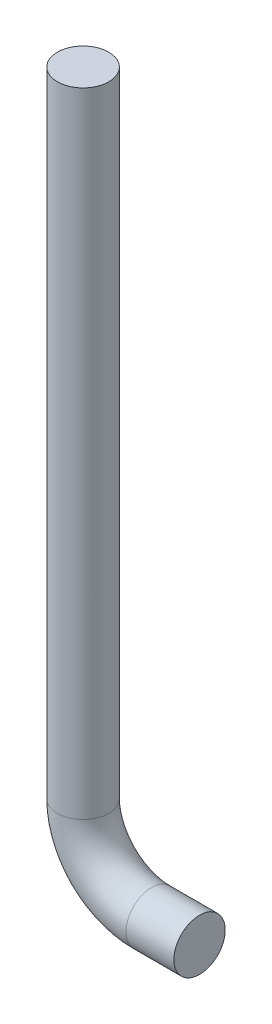
ISO-10303-21;
HEADER;
FILE_DESCRIPTION(('STEP AP214'),'2;1');
FILE_NAME('part.step','',(''),(''),'','','');
FILE_SCHEMA(('AUTOMOTIVE_DESIGN { 1 0 10303 214 1 1 1 1 }'));
ENDSEC;
DATA;
#1=APPLICATION_CONTEXT('core data for automotive mechanical design processes');
#2=APPLICATION_PROTOCOL_DEFINITION('international standard','automotive_design',2000,#1);
#3=PRODUCT_CONTEXT('',#1,'mechanical');
#4=PRODUCT('Part','Part','',(#3));
#5=PRODUCT_RELATED_PRODUCT_CATEGORY('part','',(#4));
#6=PRODUCT_DEFINITION_FORMATION('','',#4);
#7=PRODUCT_DEFINITION_CONTEXT('part definition',#1,'design');
#8=PRODUCT_DEFINITION('design','',#6,#7);
#9=PRODUCT_DEFINITION_SHAPE('','',#8);
#10=(LENGTH_UNIT() NAMED_UNIT(*) SI_UNIT(.MILLI.,.METRE.));
#11=(NAMED_UNIT(*) PLANE_ANGLE_UNIT() SI_UNIT($,.RADIAN.));
#12=(NAMED_UNIT(*) SI_UNIT($,.STERADIAN.) SOLID_ANGLE_UNIT());
#13=UNCERTAINTY_MEASURE_WITH_UNIT(LENGTH_MEASURE(1.E-05),#10,'distance_accuracy_value','');
#14=(GEOMETRIC_REPRESENTATION_CONTEXT(3) GLOBAL_UNCERTAINTY_ASSIGNED_CONTEXT((#13)) GLOBAL_UNIT_ASSIGNED_CONTEXT((#10,
#11,#12)) REPRESENTATION_CONTEXT('',''));
#15=CARTESIAN_POINT('',(0.,0.,0.));
#16=DIRECTION('',(0.,0.,1.));
#17=DIRECTION('',(1.,0.,0.));
#18=AXIS2_PLACEMENT_3D('',#15,#16,#17);
#19=CARTESIAN_POINT('',(0.,0.,0.));
#20=DIRECTION('',(0.,1.,0.));
#21=DIRECTION('',(0.,0.,1.));
#22=AXIS2_PLACEMENT_3D('',#19,#20,#21);
#23=PLANE('',#22);
#24=CARTESIAN_POINT('',(0.,0.,0.));
#25=DIRECTION('',(0.,1.,0.));
#26=DIRECTION('',(0.,0.,1.));
#27=AXIS2_PLACEMENT_3D('',#24,#25,#26);
#28=CIRCLE('',#27,7.5);
#29=CARTESIAN_POINT('',(0.,0.,7.5));
#30=VERTEX_POINT('',#29);
#31=EDGE_CURVE('E54',#30,#30,#28,.T.);
#32=ORIENTED_EDGE('',*,*,#31,.T.);
#33=EDGE_LOOP('',(#32));
#34=FACE_BOUND('',#33,.T.);
#35=ADVANCED_FACE('F37',(#34),#23,.T.);
#36=CARTESIAN_POINT('',(34.,-205.,0.));
#37=DIRECTION('',(-1.,0.,0.));
#38=DIRECTION('',(0.,0.,1.));
#39=AXIS2_PLACEMENT_3D('',#36,#37,#38);
#40=PLANE('',#39);
#41=CARTESIAN_POINT('',(34.,-205.,0.));
#42=DIRECTION('',(-1.,0.,0.));
#43=DIRECTION('',(0.,0.,1.));
#44=AXIS2_PLACEMENT_3D('',#41,#42,#43);
#45=CIRCLE('',#44,7.5);
#46=CARTESIAN_POINT('',(34.,-205.,7.5));
#47=VERTEX_POINT('',#46);
#48=EDGE_CURVE('E10',#47,#47,#45,.T.);
#49=ORIENTED_EDGE('',*,*,#48,.F.);
#50=EDGE_LOOP('',(#49));
#51=FACE_BOUND('',#50,.T.);
#52=ADVANCED_FACE('F65',(#51),#40,.F.);
#53=CARTESIAN_POINT('',(0.,0.,0.));
#54=DIRECTION('',(0.,-1.,0.));
#55=DIRECTION('',(1.,0.,0.));
#56=AXIS2_PLACEMENT_3D('',#53,#54,#55);
#57=CYLINDRICAL_SURFACE('',#56,7.5);
#58=CARTESIAN_POINT('',(0.,-185.,0.));
#59=DIRECTION('',(0.,1.,0.));
#60=DIRECTION('',(0.,0.,1.));
#61=AXIS2_PLACEMENT_3D('',#58,#59,#60);
#62=CIRCLE('',#61,7.5);
#63=CARTESIAN_POINT('',(-7.49999999999997,-185.,0.));
#64=VERTEX_POINT('',#63);
#65=EDGE_CURVE('E49',#64,#64,#62,.T.);
#66=ORIENTED_EDGE('',*,*,#65,.T.);
#67=EDGE_LOOP('',(#66));
#68=FACE_BOUND('',#67,.T.);
#69=ORIENTED_EDGE('',*,*,#31,.F.);
#70=EDGE_LOOP('',(#69));
#71=FACE_BOUND('',#70,.T.);
#72=ADVANCED_FACE('F62',(#68,#71),#57,.T.);
#73=CARTESIAN_POINT('',(20.,-185.,0.));
#74=DIRECTION('',(0.,0.,1.));
#75=DIRECTION('',(1.,0.,0.));
#76=AXIS2_PLACEMENT_3D('',#73,#74,#75);
#77=TOROIDAL_SURFACE('',#76,20.,7.5);
#78=CARTESIAN_POINT('',(20.,-205.,0.));
#79=DIRECTION('',(-1.,0.,0.));
#80=DIRECTION('',(0.,0.,1.));
#81=AXIS2_PLACEMENT_3D('',#78,#79,#80);
#82=CIRCLE('',#81,7.5);
#83=CARTESIAN_POINT('',(20.,-212.5,0.));
#84=VERTEX_POINT('',#83);
#85=EDGE_CURVE('E44',#84,#84,#82,.T.);
#86=CARTESIAN_POINT('',(20.,-185.,0.));
#87=DIRECTION('',(0.,0.,1.));
#88=DIRECTION('',(1.,0.,0.));
#89=AXIS2_PLACEMENT_3D('',#86,#87,#88);
#90=CIRCLE('',#89,27.5);
#91=EDGE_CURVE('',#64,#84,#90,.T.);
#92=ORIENTED_EDGE('',*,*,#65,.F.);
#93=ORIENTED_EDGE('',*,*,#85,.T.);
#94=ORIENTED_EDGE('',*,*,#91,.T.);
#95=ORIENTED_EDGE('',*,*,#91,.F.);
#96=EDGE_LOOP('',(#92,#94,#93,#95));
#97=FACE_BOUND('',#96,.T.);
#98=ADVANCED_FACE('F64',(#97),#77,.T.);
#99=CARTESIAN_POINT('',(20.,-205.,0.));
#100=DIRECTION('',(1.,0.,0.));
#101=DIRECTION('',(0.,0.,-1.));
#102=AXIS2_PLACEMENT_3D('',#99,#100,#101);
#103=CYLINDRICAL_SURFACE('',#102,7.5);
#104=ORIENTED_EDGE('',*,*,#48,.T.);
#105=EDGE_LOOP('',(#104));
#106=FACE_BOUND('',#105,.T.);
#107=ORIENTED_EDGE('',*,*,#85,.F.);
#108=EDGE_LOOP('',(#107));
#109=FACE_BOUND('',#108,.T.);
#110=ADVANCED_FACE('F72',(#106,#109),#103,.T.);
#111=CLOSED_SHELL('',(#35,#52,#72,#98,#110));
#112=MANIFOLD_SOLID_BREP('B2',#111);
#113=ADVANCED_BREP_SHAPE_REPRESENTATION('',(#18,#112),#14);
#114=SHAPE_DEFINITION_REPRESENTATION(#9,#113);
ENDSEC;
END-ISO-10303-21;
